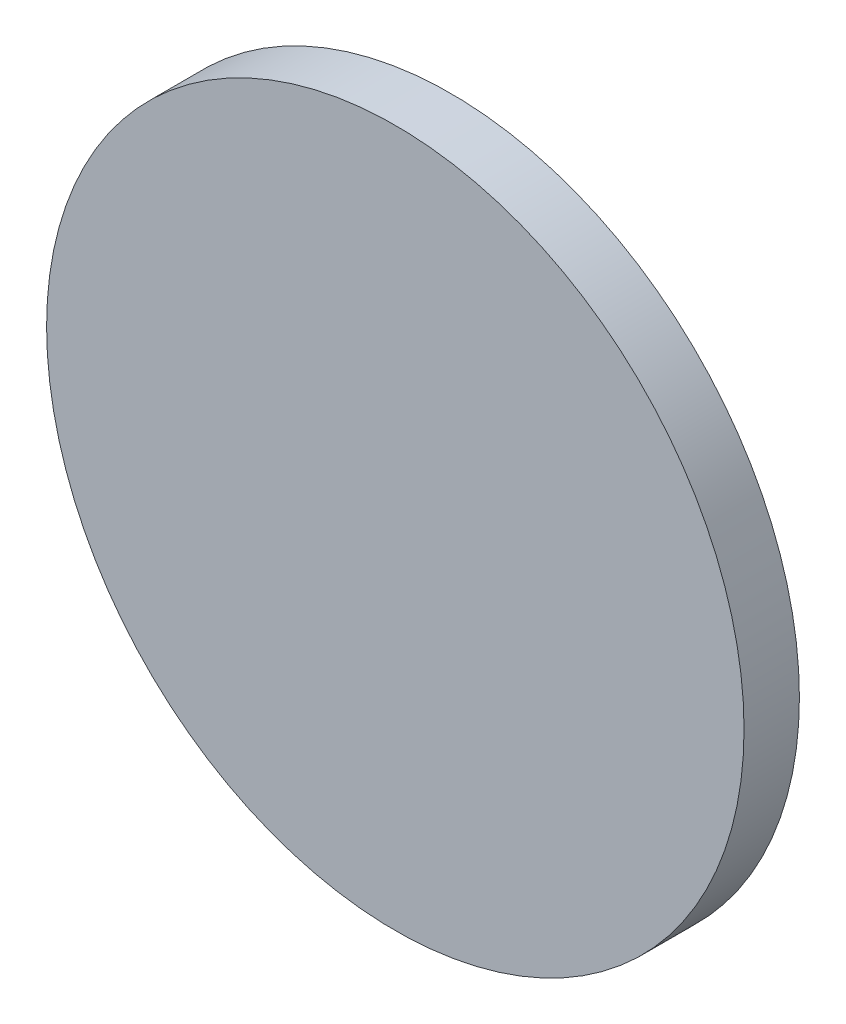
ISO-10303-21;
HEADER;
FILE_DESCRIPTION(('STEP AP214'),'2;1');
FILE_NAME('part.step','',(''),(''),'','','');
FILE_SCHEMA(('AUTOMOTIVE_DESIGN { 1 0 10303 214 1 1 1 1 }'));
ENDSEC;
DATA;
#1=APPLICATION_CONTEXT('core data for automotive mechanical design processes');
#2=APPLICATION_PROTOCOL_DEFINITION('international standard','automotive_design',2000,#1);
#3=PRODUCT_CONTEXT('',#1,'mechanical');
#4=PRODUCT('Part','Part','',(#3));
#5=PRODUCT_RELATED_PRODUCT_CATEGORY('part','',(#4));
#6=PRODUCT_DEFINITION_FORMATION('','',#4);
#7=PRODUCT_DEFINITION_CONTEXT('part definition',#1,'design');
#8=PRODUCT_DEFINITION('design','',#6,#7);
#9=PRODUCT_DEFINITION_SHAPE('','',#8);
#10=(LENGTH_UNIT() NAMED_UNIT(*) SI_UNIT(.MILLI.,.METRE.));
#11=(NAMED_UNIT(*) PLANE_ANGLE_UNIT() SI_UNIT($,.RADIAN.));
#12=(NAMED_UNIT(*) SI_UNIT($,.STERADIAN.) SOLID_ANGLE_UNIT());
#13=UNCERTAINTY_MEASURE_WITH_UNIT(LENGTH_MEASURE(1.E-05),#10,'distance_accuracy_value','');
#14=(GEOMETRIC_REPRESENTATION_CONTEXT(3) GLOBAL_UNCERTAINTY_ASSIGNED_CONTEXT((#13)) GLOBAL_UNIT_ASSIGNED_CONTEXT((#10,
#11,#12)) REPRESENTATION_CONTEXT('',''));
#15=CARTESIAN_POINT('',(0.,0.,0.));
#16=DIRECTION('',(0.,0.,1.));
#17=DIRECTION('',(1.,0.,0.));
#18=AXIS2_PLACEMENT_3D('',#15,#16,#17);
#19=CARTESIAN_POINT('',(0.,0.,5.));
#20=DIRECTION('',(0.,0.,-1.));
#21=DIRECTION('',(-1.,0.,0.));
#22=AXIS2_PLACEMENT_3D('',#19,#20,#21);
#23=CYLINDRICAL_SURFACE('',#22,31.5);
#24=CARTESIAN_POINT('',(0.,0.,5.));
#25=DIRECTION('',(0.,0.,1.));
#26=DIRECTION('',(1.,0.,0.));
#27=AXIS2_PLACEMENT_3D('',#24,#25,#26);
#28=CIRCLE('',#27,31.5);
#29=CARTESIAN_POINT('',(31.5,0.,5.));
#30=VERTEX_POINT('',#29);
#31=EDGE_CURVE('E10',#30,#30,#28,.T.);
#32=ORIENTED_EDGE('',*,*,#31,.F.);
#33=EDGE_LOOP('',(#32));
#34=FACE_BOUND('',#33,.T.);
#35=CARTESIAN_POINT('',(0.,0.,0.));
#36=DIRECTION('',(0.,0.,1.));
#37=DIRECTION('',(1.,0.,0.));
#38=AXIS2_PLACEMENT_3D('',#35,#36,#37);
#39=CIRCLE('',#38,31.5);
#40=CARTESIAN_POINT('',(31.5,0.,0.));
#41=VERTEX_POINT('',#40);
#42=EDGE_CURVE('E40',#41,#41,#39,.T.);
#43=ORIENTED_EDGE('',*,*,#42,.T.);
#44=EDGE_LOOP('',(#43));
#45=FACE_BOUND('',#44,.T.);
#46=ADVANCED_FACE('F37',(#34,#45),#23,.T.);
#47=CARTESIAN_POINT('',(0.,0.,5.));
#48=DIRECTION('',(0.,0.,1.));
#49=DIRECTION('',(1.,0.,0.));
#50=AXIS2_PLACEMENT_3D('',#47,#48,#49);
#51=PLANE('',#50);
#52=ORIENTED_EDGE('',*,*,#31,.T.);
#53=EDGE_LOOP('',(#52));
#54=FACE_BOUND('',#53,.T.);
#55=ADVANCED_FACE('F54',(#54),#51,.T.);
#56=CARTESIAN_POINT('',(0.,0.,0.));
#57=DIRECTION('',(0.,0.,1.));
#58=DIRECTION('',(1.,0.,0.));
#59=AXIS2_PLACEMENT_3D('',#56,#57,#58);
#60=PLANE('',#59);
#61=ORIENTED_EDGE('',*,*,#42,.F.);
#62=EDGE_LOOP('',(#61));
#63=FACE_BOUND('',#62,.T.);
#64=ADVANCED_FACE('F52',(#63),#60,.F.);
#65=CLOSED_SHELL('',(#46,#55,#64));
#66=MANIFOLD_SOLID_BREP('B2',#65);
#67=ADVANCED_BREP_SHAPE_REPRESENTATION('',(#18,#66),#14);
#68=SHAPE_DEFINITION_REPRESENTATION(#9,#67);
ENDSEC;
END-ISO-10303-21;
